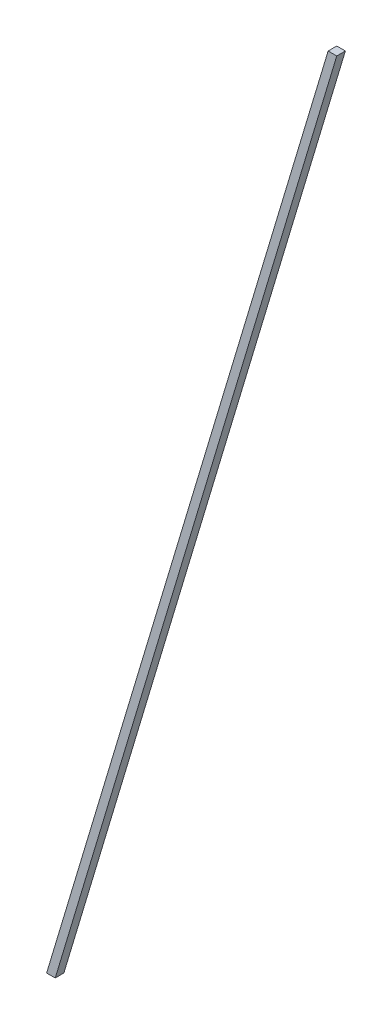
ISO-10303-21;
HEADER;
FILE_DESCRIPTION(('STEP AP214'),'2;1');
FILE_NAME('part.step','',(''),(''),'','','');
FILE_SCHEMA(('AUTOMOTIVE_DESIGN { 1 0 10303 214 1 1 1 1 }'));
ENDSEC;
DATA;
#1=APPLICATION_CONTEXT('core data for automotive mechanical design processes');
#2=APPLICATION_PROTOCOL_DEFINITION('international standard','automotive_design',2000,#1);
#3=PRODUCT_CONTEXT('',#1,'mechanical');
#4=PRODUCT('Part','Part','',(#3));
#5=PRODUCT_RELATED_PRODUCT_CATEGORY('part','',(#4));
#6=PRODUCT_DEFINITION_FORMATION('','',#4);
#7=PRODUCT_DEFINITION_CONTEXT('part definition',#1,'design');
#8=PRODUCT_DEFINITION('design','',#6,#7);
#9=PRODUCT_DEFINITION_SHAPE('','',#8);
#10=(LENGTH_UNIT() NAMED_UNIT(*) SI_UNIT(.MILLI.,.METRE.));
#11=(NAMED_UNIT(*) PLANE_ANGLE_UNIT() SI_UNIT($,.RADIAN.));
#12=(NAMED_UNIT(*) SI_UNIT($,.STERADIAN.) SOLID_ANGLE_UNIT());
#13=UNCERTAINTY_MEASURE_WITH_UNIT(LENGTH_MEASURE(1.E-05),#10,'distance_accuracy_value','');
#14=(GEOMETRIC_REPRESENTATION_CONTEXT(3) GLOBAL_UNCERTAINTY_ASSIGNED_CONTEXT((#13)) GLOBAL_UNIT_ASSIGNED_CONTEXT((#10,
#11,#12)) REPRESENTATION_CONTEXT('',''));
#15=CARTESIAN_POINT('',(0.,0.,0.));
#16=DIRECTION('',(0.,0.,1.));
#17=DIRECTION('',(1.,0.,0.));
#18=AXIS2_PLACEMENT_3D('',#15,#16,#17);
#19=CARTESIAN_POINT('',(166.542522137845,169.098000970646,3.));
#20=DIRECTION('',(0.,-1.,0.));
#21=DIRECTION('',(0.,0.,-1.));
#22=AXIS2_PLACEMENT_3D('',#19,#20,#21);
#23=PLANE('',#22);
#24=DIRECTION('',(-1.,0.,0.));
#25=VECTOR('',#24,1.);
#26=CARTESIAN_POINT('',(166.542522137845,169.098000970646,0.));
#27=LINE('',#26,#25);
#28=CARTESIAN_POINT('',(166.542522137845,169.098000970646,0.));
#29=VERTEX_POINT('',#28);
#30=CARTESIAN_POINT('',(163.542522137845,169.098000970646,0.));
#31=VERTEX_POINT('',#30);
#32=EDGE_CURVE('E96',#29,#31,#27,.T.);
#33=ORIENTED_EDGE('',*,*,#32,.T.);
#34=DIRECTION('',(0.,0.,-1.));
#35=VECTOR('',#34,1.);
#36=CARTESIAN_POINT('',(163.542522137845,169.098000970646,3.));
#37=LINE('',#36,#35);
#38=CARTESIAN_POINT('',(163.542522137845,169.098000970646,3.));
#39=VERTEX_POINT('',#38);
#40=EDGE_CURVE('E11',#39,#31,#37,.T.);
#41=ORIENTED_EDGE('',*,*,#40,.F.);
#42=DIRECTION('',(-1.,0.,0.));
#43=VECTOR('',#42,1.);
#44=CARTESIAN_POINT('',(166.542522137845,169.098000970646,3.));
#45=LINE('',#44,#43);
#46=CARTESIAN_POINT('',(166.542522137845,169.098000970646,3.));
#47=VERTEX_POINT('',#46);
#48=EDGE_CURVE('E84',#47,#39,#45,.T.);
#49=ORIENTED_EDGE('',*,*,#48,.F.);
#50=DIRECTION('',(0.,0.,-1.));
#51=VECTOR('',#50,1.);
#52=CARTESIAN_POINT('',(166.542522137845,169.098000970646,3.));
#53=LINE('',#52,#51);
#54=EDGE_CURVE('E92',#47,#29,#53,.T.);
#55=ORIENTED_EDGE('',*,*,#54,.T.);
#56=EDGE_LOOP('',(#33,#41,#49,#55));
#57=FACE_BOUND('',#56,.T.);
#58=ADVANCED_FACE('F33',(#57),#23,.F.);
#59=CARTESIAN_POINT('',(163.542522137845,169.098000970646,3.));
#60=DIRECTION('',(0.957902068165666,-0.287095154615922,0.));
#61=DIRECTION('',(0.287095154615922,0.957902068165666,0.));
#62=AXIS2_PLACEMENT_3D('',#59,#60,#61);
#63=PLANE('',#62);
#64=DIRECTION('',(-0.287095154615922,-0.957902068165666,0.));
#65=VECTOR('',#64,1.);
#66=CARTESIAN_POINT('',(163.542522137845,169.098000970646,0.));
#67=LINE('',#66,#65);
#68=CARTESIAN_POINT('',(65.5365581887535,-157.901999029349,0.));
#69=VERTEX_POINT('',#68);
#70=EDGE_CURVE('E88',#31,#69,#67,.T.);
#71=ORIENTED_EDGE('',*,*,#70,.T.);
#72=DIRECTION('',(0.,0.,-1.));
#73=VECTOR('',#72,1.);
#74=CARTESIAN_POINT('',(65.5365581887535,-157.901999029349,3.));
#75=LINE('',#74,#73);
#76=CARTESIAN_POINT('',(65.5365581887535,-157.901999029349,3.));
#77=VERTEX_POINT('',#76);
#78=EDGE_CURVE('E41',#77,#69,#75,.T.);
#79=ORIENTED_EDGE('',*,*,#78,.F.);
#80=DIRECTION('',(-0.287095154615922,-0.957902068165666,0.));
#81=VECTOR('',#80,1.);
#82=CARTESIAN_POINT('',(163.542522137845,169.098000970646,3.));
#83=LINE('',#82,#81);
#84=EDGE_CURVE('E79',#39,#77,#83,.T.);
#85=ORIENTED_EDGE('',*,*,#84,.F.);
#86=ORIENTED_EDGE('',*,*,#40,.T.);
#87=EDGE_LOOP('',(#71,#79,#85,#86));
#88=FACE_BOUND('',#87,.T.);
#89=ADVANCED_FACE('F87',(#88),#63,.F.);
#90=CARTESIAN_POINT('',(68.5365581887535,-157.901999029349,3.));
#91=DIRECTION('',(0.,1.,0.));
#92=DIRECTION('',(0.,0.,1.));
#93=AXIS2_PLACEMENT_3D('',#90,#91,#92);
#94=PLANE('',#93);
#95=DIRECTION('',(1.,0.,0.));
#96=VECTOR('',#95,1.);
#97=CARTESIAN_POINT('',(68.5365581887535,-157.901999029349,0.));
#98=LINE('',#97,#96);
#99=CARTESIAN_POINT('',(68.5365581887535,-157.901999029349,0.));
#100=VERTEX_POINT('',#99);
#101=EDGE_CURVE('E66',#69,#100,#98,.T.);
#102=ORIENTED_EDGE('',*,*,#101,.T.);
#103=DIRECTION('',(0.,0.,-1.));
#104=VECTOR('',#103,1.);
#105=CARTESIAN_POINT('',(68.5365581887535,-157.901999029349,3.));
#106=LINE('',#105,#104);
#107=CARTESIAN_POINT('',(68.5365581887535,-157.901999029349,3.));
#108=VERTEX_POINT('',#107);
#109=EDGE_CURVE('E89',#108,#100,#106,.T.);
#110=ORIENTED_EDGE('',*,*,#109,.F.);
#111=DIRECTION('',(1.,0.,0.));
#112=VECTOR('',#111,1.);
#113=CARTESIAN_POINT('',(68.5365581887535,-157.901999029349,3.));
#114=LINE('',#113,#112);
#115=EDGE_CURVE('E82',#77,#108,#114,.T.);
#116=ORIENTED_EDGE('',*,*,#115,.F.);
#117=ORIENTED_EDGE('',*,*,#78,.T.);
#118=EDGE_LOOP('',(#102,#110,#116,#117));
#119=FACE_BOUND('',#118,.T.);
#120=ADVANCED_FACE('F90',(#119),#94,.F.);
#121=CARTESIAN_POINT('',(166.542522137845,169.098000970646,3.));
#122=DIRECTION('',(-0.957902068165666,0.287095154615922,0.));
#123=DIRECTION('',(-0.287095154615922,-0.957902068165666,0.));
#124=AXIS2_PLACEMENT_3D('',#121,#122,#123);
#125=PLANE('',#124);
#126=DIRECTION('',(0.287095154615922,0.957902068165666,0.));
#127=VECTOR('',#126,1.);
#128=CARTESIAN_POINT('',(166.542522137845,169.098000970646,0.));
#129=LINE('',#128,#127);
#130=EDGE_CURVE('E72',#100,#29,#129,.T.);
#131=ORIENTED_EDGE('',*,*,#130,.T.);
#132=ORIENTED_EDGE('',*,*,#54,.F.);
#133=DIRECTION('',(0.287095154615922,0.957902068165666,0.));
#134=VECTOR('',#133,1.);
#135=CARTESIAN_POINT('',(166.542522137845,169.098000970646,3.));
#136=LINE('',#135,#134);
#137=EDGE_CURVE('E49',#108,#47,#136,.T.);
#138=ORIENTED_EDGE('',*,*,#137,.F.);
#139=ORIENTED_EDGE('',*,*,#109,.T.);
#140=EDGE_LOOP('',(#131,#132,#138,#139));
#141=FACE_BOUND('',#140,.T.);
#142=ADVANCED_FACE('F103',(#141),#125,.F.);
#143=CARTESIAN_POINT('',(0.,0.,3.));
#144=DIRECTION('',(0.,0.,1.));
#145=DIRECTION('',(1.,0.,0.));
#146=AXIS2_PLACEMENT_3D('',#143,#144,#145);
#147=PLANE('',#146);
#148=ORIENTED_EDGE('',*,*,#48,.T.);
#149=ORIENTED_EDGE('',*,*,#84,.T.);
#150=ORIENTED_EDGE('',*,*,#115,.T.);
#151=ORIENTED_EDGE('',*,*,#137,.T.);
#152=EDGE_LOOP('',(#148,#149,#150,#151));
#153=FACE_BOUND('',#152,.T.);
#154=ADVANCED_FACE('F80',(#153),#147,.T.);
#155=CARTESIAN_POINT('',(0.,0.,0.));
#156=DIRECTION('',(0.,0.,1.));
#157=DIRECTION('',(1.,0.,0.));
#158=AXIS2_PLACEMENT_3D('',#155,#156,#157);
#159=PLANE('',#158);
#160=ORIENTED_EDGE('',*,*,#32,.F.);
#161=ORIENTED_EDGE('',*,*,#130,.F.);
#162=ORIENTED_EDGE('',*,*,#101,.F.);
#163=ORIENTED_EDGE('',*,*,#70,.F.);
#164=EDGE_LOOP('',(#160,#161,#162,#163));
#165=FACE_BOUND('',#164,.T.);
#166=ADVANCED_FACE('F106',(#165),#159,.F.);
#167=CLOSED_SHELL('',(#58,#89,#120,#142,#154,#166));
#168=MANIFOLD_SOLID_BREP('B2',#167);
#169=ADVANCED_BREP_SHAPE_REPRESENTATION('',(#18,#168),#14);
#170=SHAPE_DEFINITION_REPRESENTATION(#9,#169);
ENDSEC;
END-ISO-10303-21;
